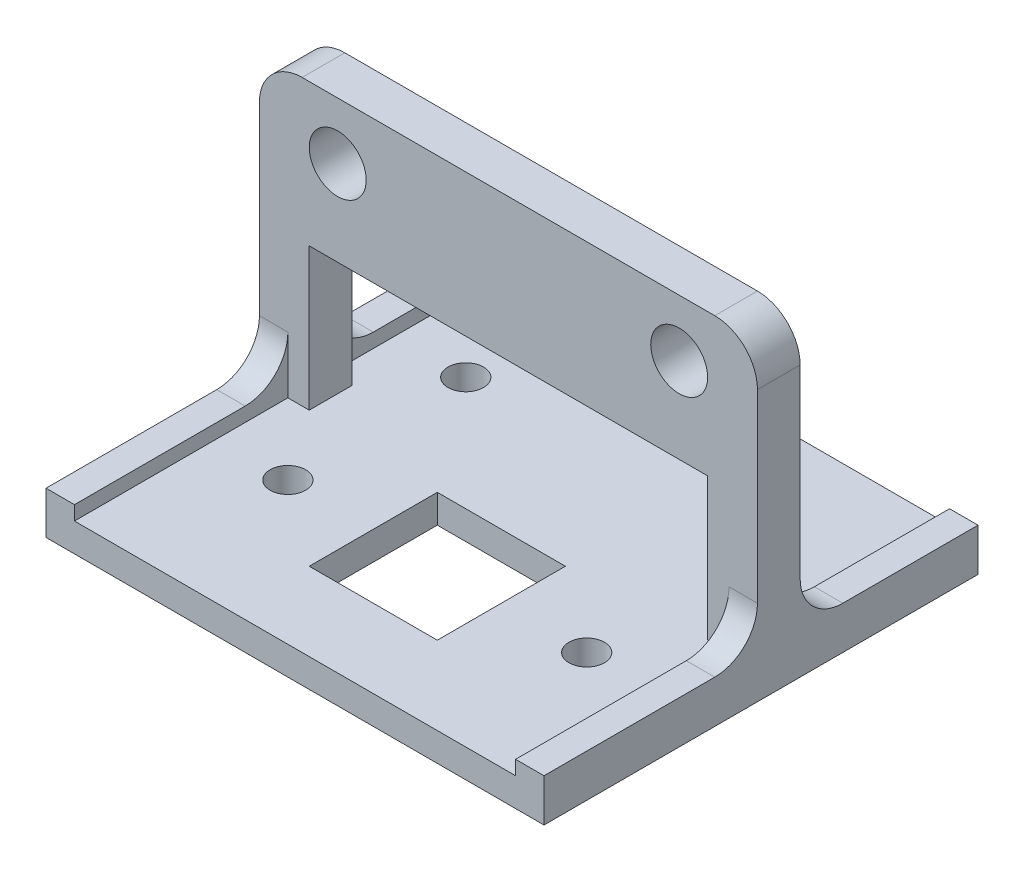
ISO-10303-21;
HEADER;
FILE_DESCRIPTION(('STEP AP214'),'2;1');
FILE_NAME('part.step','',(''),(''),'','','');
FILE_SCHEMA(('AUTOMOTIVE_DESIGN { 1 0 10303 214 1 1 1 1 }'));
ENDSEC;
DATA;
#1=APPLICATION_CONTEXT('core data for automotive mechanical design processes');
#2=APPLICATION_PROTOCOL_DEFINITION('international standard','automotive_design',2000,#1);
#3=PRODUCT_CONTEXT('',#1,'mechanical');
#4=PRODUCT('Part','Part','',(#3));
#5=PRODUCT_RELATED_PRODUCT_CATEGORY('part','',(#4));
#6=PRODUCT_DEFINITION_FORMATION('','',#4);
#7=PRODUCT_DEFINITION_CONTEXT('part definition',#1,'design');
#8=PRODUCT_DEFINITION('design','',#6,#7);
#9=PRODUCT_DEFINITION_SHAPE('','',#8);
#10=(LENGTH_UNIT() NAMED_UNIT(*) SI_UNIT(.MILLI.,.METRE.));
#11=(NAMED_UNIT(*) PLANE_ANGLE_UNIT() SI_UNIT($,.RADIAN.));
#12=(NAMED_UNIT(*) SI_UNIT($,.STERADIAN.) SOLID_ANGLE_UNIT());
#13=UNCERTAINTY_MEASURE_WITH_UNIT(LENGTH_MEASURE(1.E-05),#10,'distance_accuracy_value','');
#14=(GEOMETRIC_REPRESENTATION_CONTEXT(3) GLOBAL_UNCERTAINTY_ASSIGNED_CONTEXT((#13)) GLOBAL_UNIT_ASSIGNED_CONTEXT((#10,
#11,#12)) REPRESENTATION_CONTEXT('',''));
#15=CARTESIAN_POINT('',(0.,0.,0.));
#16=DIRECTION('',(0.,0.,1.));
#17=DIRECTION('',(1.,0.,0.));
#18=AXIS2_PLACEMENT_3D('',#15,#16,#17);
#19=CARTESIAN_POINT('',(0.,3.,0.));
#20=DIRECTION('',(0.,1.,0.));
#21=DIRECTION('',(0.,0.,1.));
#22=AXIS2_PLACEMENT_3D('',#19,#20,#21);
#23=PLANE('',#22);
#24=DIRECTION('',(0.,0.,1.));
#25=VECTOR('',#24,1.);
#26=CARTESIAN_POINT('',(28.,3.,0.499999999999998));
#27=LINE('',#26,#25);
#28=CARTESIAN_POINT('',(28.,3.,-30.));
#29=VERTEX_POINT('',#28);
#30=CARTESIAN_POINT('',(28.,3.,-20.5));
#31=VERTEX_POINT('',#30);
#32=EDGE_CURVE('E368',#29,#31,#27,.T.);
#33=ORIENTED_EDGE('',*,*,#32,.T.);
#34=DIRECTION('',(-1.,0.,0.));
#35=VECTOR('',#34,1.);
#36=CARTESIAN_POINT('',(30.,3.,-20.5));
#37=LINE('',#36,#35);
#38=CARTESIAN_POINT('',(30.,3.,-20.5));
#39=VERTEX_POINT('',#38);
#40=EDGE_CURVE('E479',#31,#39,#37,.F.);
#41=ORIENTED_EDGE('',*,*,#40,.T.);
#42=DIRECTION('',(0.,0.,-1.));
#43=VECTOR('',#42,1.);
#44=CARTESIAN_POINT('',(30.,3.,0.499999999999998));
#45=LINE('',#44,#43);
#46=CARTESIAN_POINT('',(30.,3.,-30.));
#47=VERTEX_POINT('',#46);
#48=EDGE_CURVE('E375',#39,#47,#45,.T.);
#49=ORIENTED_EDGE('',*,*,#48,.T.);
#50=DIRECTION('',(-1.,0.,0.));
#51=VECTOR('',#50,1.);
#52=CARTESIAN_POINT('',(30.,3.,-30.));
#53=LINE('',#52,#51);
#54=EDGE_CURVE('E380',#47,#29,#53,.T.);
#55=ORIENTED_EDGE('',*,*,#54,.T.);
#56=EDGE_LOOP('',(#33,#41,#49,#55));
#57=FACE_BOUND('',#56,.T.);
#58=ADVANCED_FACE('F39',(#57),#23,.T.);
#59=CARTESIAN_POINT('',(0.,2.,0.));
#60=DIRECTION('',(0.,1.,0.));
#61=DIRECTION('',(0.,0.,1.));
#62=AXIS2_PLACEMENT_3D('',#59,#60,#61);
#63=PLANE('',#62);
#64=DIRECTION('',(0.,0.,-1.));
#65=VECTOR('',#64,1.);
#66=CARTESIAN_POINT('',(-1.5,2.,-14.5));
#67=LINE('',#66,#65);
#68=CARTESIAN_POINT('',(-1.5,2.,-14.5));
#69=VERTEX_POINT('',#68);
#70=CARTESIAN_POINT('',(-1.5,2.,-17.5));
#71=VERTEX_POINT('',#70);
#72=EDGE_CURVE('E284',#69,#71,#67,.T.);
#73=ORIENTED_EDGE('',*,*,#72,.F.);
#74=DIRECTION('',(-1.,0.,0.));
#75=VECTOR('',#74,1.);
#76=CARTESIAN_POINT('',(0.,2.,-14.5));
#77=LINE('',#76,#75);
#78=CARTESIAN_POINT('',(-3.,2.,-14.5));
#79=VERTEX_POINT('',#78);
#80=EDGE_CURVE('E329',#69,#79,#77,.T.);
#81=ORIENTED_EDGE('',*,*,#80,.T.);
#82=DIRECTION('',(0.,0.,-1.));
#83=VECTOR('',#82,1.);
#84=CARTESIAN_POINT('',(-3.,2.,0.5));
#85=LINE('',#84,#83);
#86=CARTESIAN_POINT('',(-3.,2.,0.5));
#87=VERTEX_POINT('',#86);
#88=EDGE_CURVE('E244',#87,#79,#85,.T.);
#89=ORIENTED_EDGE('',*,*,#88,.F.);
#90=DIRECTION('',(1.,0.,0.));
#91=VECTOR('',#90,1.);
#92=CARTESIAN_POINT('',(-5.,2.,0.5));
#93=LINE('',#92,#91);
#94=CARTESIAN_POINT('',(28.,2.,0.499999999999998));
#95=VERTEX_POINT('',#94);
#96=EDGE_CURVE('E421',#87,#95,#93,.T.);
#97=ORIENTED_EDGE('',*,*,#96,.T.);
#98=DIRECTION('',(0.,0.,1.));
#99=VECTOR('',#98,1.);
#100=CARTESIAN_POINT('',(28.,2.,0.499999999999998));
#101=LINE('',#100,#99);
#102=CARTESIAN_POINT('',(28.,2.,-14.5));
#103=VERTEX_POINT('',#102);
#104=EDGE_CURVE('E385',#103,#95,#101,.T.);
#105=ORIENTED_EDGE('',*,*,#104,.F.);
#106=CARTESIAN_POINT('',(26.5,2.,-14.5));
#107=VERTEX_POINT('',#106);
#108=EDGE_CURVE('E331',#103,#107,#77,.T.);
#109=ORIENTED_EDGE('',*,*,#108,.T.);
#110=DIRECTION('',(0.,0.,-1.));
#111=VECTOR('',#110,1.);
#112=CARTESIAN_POINT('',(26.5,2.,-14.5));
#113=LINE('',#112,#111);
#114=CARTESIAN_POINT('',(26.5,2.,-17.5));
#115=VERTEX_POINT('',#114);
#116=EDGE_CURVE('E272',#107,#115,#113,.T.);
#117=ORIENTED_EDGE('',*,*,#116,.T.);
#118=DIRECTION('',(-1.,0.,0.));
#119=VECTOR('',#118,1.);
#120=CARTESIAN_POINT('',(0.,2.,-17.5));
#121=LINE('',#120,#119);
#122=CARTESIAN_POINT('',(28.,2.,-17.5));
#123=VERTEX_POINT('',#122);
#124=EDGE_CURVE('E323',#123,#115,#121,.T.);
#125=ORIENTED_EDGE('',*,*,#124,.F.);
#126=CARTESIAN_POINT('',(28.,2.,-30.));
#127=VERTEX_POINT('',#126);
#128=EDGE_CURVE('E253',#127,#123,#101,.T.);
#129=ORIENTED_EDGE('',*,*,#128,.F.);
#130=DIRECTION('',(1.,0.,0.));
#131=VECTOR('',#130,1.);
#132=CARTESIAN_POINT('',(-3.,2.,-30.));
#133=LINE('',#132,#131);
#134=CARTESIAN_POINT('',(-3.,2.,-30.));
#135=VERTEX_POINT('',#134);
#136=EDGE_CURVE('E246',#135,#127,#133,.T.);
#137=ORIENTED_EDGE('',*,*,#136,.F.);
#138=CARTESIAN_POINT('',(-3.,2.,-17.5));
#139=VERTEX_POINT('',#138);
#140=EDGE_CURVE('E233',#139,#135,#85,.T.);
#141=ORIENTED_EDGE('',*,*,#140,.F.);
#142=EDGE_CURVE('E324',#71,#139,#121,.T.);
#143=ORIENTED_EDGE('',*,*,#142,.F.);
#144=EDGE_LOOP('',(#73,#81,#89,#97,#105,#109,#117,#125,#129,#137,#141,#143));
#145=FACE_BOUND('',#144,.T.);
#146=CARTESIAN_POINT('',(23.,2.,-22.));
#147=DIRECTION('',(0.,1.,0.));
#148=DIRECTION('',(0.,0.,1.));
#149=AXIS2_PLACEMENT_3D('',#146,#147,#148);
#150=CIRCLE('',#149,1.25);
#151=CARTESIAN_POINT('',(23.,2.,-20.75));
#152=VERTEX_POINT('',#151);
#153=EDGE_CURVE('E346',#152,#152,#150,.T.);
#154=ORIENTED_EDGE('',*,*,#153,.F.);
#155=EDGE_LOOP('',(#154));
#156=FACE_BOUND('',#155,.T.);
#157=CARTESIAN_POINT('',(2.,2.,-22.));
#158=DIRECTION('',(0.,1.,0.));
#159=DIRECTION('',(0.,0.,1.));
#160=AXIS2_PLACEMENT_3D('',#157,#158,#159);
#161=CIRCLE('',#160,1.25);
#162=CARTESIAN_POINT('',(2.,2.,-20.75));
#163=VERTEX_POINT('',#162);
#164=EDGE_CURVE('E345',#163,#163,#161,.T.);
#165=ORIENTED_EDGE('',*,*,#164,.F.);
#166=EDGE_LOOP('',(#165));
#167=FACE_BOUND('',#166,.T.);
#168=DIRECTION('',(0.,0.,1.));
#169=VECTOR('',#168,1.);
#170=CARTESIAN_POINT('',(8.,2.,-14.));
#171=LINE('',#170,#169);
#172=CARTESIAN_POINT('',(8.,2.,-14.));
#173=VERTEX_POINT('',#172);
#174=CARTESIAN_POINT('',(8.,2.,-5.));
#175=VERTEX_POINT('',#174);
#176=EDGE_CURVE('E395',#173,#175,#171,.T.);
#177=ORIENTED_EDGE('',*,*,#176,.F.);
#178=DIRECTION('',(-1.,0.,0.));
#179=VECTOR('',#178,1.);
#180=CARTESIAN_POINT('',(8.,2.,-14.));
#181=LINE('',#180,#179);
#182=CARTESIAN_POINT('',(17.,2.,-14.));
#183=VERTEX_POINT('',#182);
#184=EDGE_CURVE('E388',#183,#173,#181,.T.);
#185=ORIENTED_EDGE('',*,*,#184,.F.);
#186=DIRECTION('',(0.,0.,-1.));
#187=VECTOR('',#186,1.);
#188=CARTESIAN_POINT('',(17.,2.,-14.));
#189=LINE('',#188,#187);
#190=CARTESIAN_POINT('',(17.,2.,-5.));
#191=VERTEX_POINT('',#190);
#192=EDGE_CURVE('E400',#191,#183,#189,.T.);
#193=ORIENTED_EDGE('',*,*,#192,.F.);
#194=DIRECTION('',(1.,0.,0.));
#195=VECTOR('',#194,1.);
#196=CARTESIAN_POINT('',(8.,2.,-5.));
#197=LINE('',#196,#195);
#198=EDGE_CURVE('E394',#175,#191,#197,.T.);
#199=ORIENTED_EDGE('',*,*,#198,.F.);
#200=EDGE_LOOP('',(#177,#185,#193,#199));
#201=FACE_BOUND('',#200,.T.);
#202=CARTESIAN_POINT('',(2.,2.,-9.5));
#203=DIRECTION('',(0.,1.,0.));
#204=DIRECTION('',(0.,0.,1.));
#205=AXIS2_PLACEMENT_3D('',#202,#203,#204);
#206=CIRCLE('',#205,1.25);
#207=CARTESIAN_POINT('',(2.,2.,-8.25));
#208=VERTEX_POINT('',#207);
#209=EDGE_CURVE('E336',#208,#208,#206,.T.);
#210=ORIENTED_EDGE('',*,*,#209,.F.);
#211=EDGE_LOOP('',(#210));
#212=FACE_BOUND('',#211,.T.);
#213=CARTESIAN_POINT('',(23.,2.,-9.5));
#214=DIRECTION('',(0.,1.,0.));
#215=DIRECTION('',(0.,0.,1.));
#216=AXIS2_PLACEMENT_3D('',#213,#214,#215);
#217=CIRCLE('',#216,1.25);
#218=CARTESIAN_POINT('',(23.,2.,-8.25));
#219=VERTEX_POINT('',#218);
#220=EDGE_CURVE('E339',#219,#219,#217,.T.);
#221=ORIENTED_EDGE('',*,*,#220,.F.);
#222=EDGE_LOOP('',(#221));
#223=FACE_BOUND('',#222,.T.);
#224=ADVANCED_FACE('F248',(#145,#156,#167,#201,#212,#223),#63,.T.);
#225=CARTESIAN_POINT('',(-3.,3.,0.5));
#226=DIRECTION('',(-1.,0.,0.));
#227=DIRECTION('',(0.,0.,1.));
#228=AXIS2_PLACEMENT_3D('',#225,#226,#227);
#229=PLANE('',#228);
#230=DIRECTION('',(0.,-1.,0.));
#231=VECTOR('',#230,1.);
#232=CARTESIAN_POINT('',(-3.,3.,-14.5));
#233=LINE('',#232,#231);
#234=CARTESIAN_POINT('',(-3.,6.,-14.5));
#235=VERTEX_POINT('',#234);
#236=EDGE_CURVE('E330',#235,#79,#233,.T.);
#237=ORIENTED_EDGE('',*,*,#236,.F.);
#238=CARTESIAN_POINT('',(-3.,6.,-11.5));
#239=DIRECTION('',(-1.,0.,0.));
#240=DIRECTION('',(0.,0.,1.));
#241=AXIS2_PLACEMENT_3D('',#238,#239,#240);
#242=CIRCLE('',#241,3.);
#243=CARTESIAN_POINT('',(-3.,3.,-11.5));
#244=VERTEX_POINT('',#243);
#245=EDGE_CURVE('E489',#235,#244,#242,.T.);
#246=ORIENTED_EDGE('',*,*,#245,.T.);
#247=DIRECTION('',(0.,0.,-1.));
#248=VECTOR('',#247,1.);
#249=CARTESIAN_POINT('',(-3.,3.,0.5));
#250=LINE('',#249,#248);
#251=CARTESIAN_POINT('',(-3.,3.,0.5));
#252=VERTEX_POINT('',#251);
#253=EDGE_CURVE('E361',#252,#244,#250,.T.);
#254=ORIENTED_EDGE('',*,*,#253,.F.);
#255=DIRECTION('',(0.,-1.,0.));
#256=VECTOR('',#255,1.);
#257=CARTESIAN_POINT('',(-3.,3.,0.5));
#258=LINE('',#257,#256);
#259=EDGE_CURVE('E387',#252,#87,#258,.T.);
#260=ORIENTED_EDGE('',*,*,#259,.T.);
#261=ORIENTED_EDGE('',*,*,#88,.T.);
#262=EDGE_LOOP('',(#237,#246,#254,#260,#261));
#263=FACE_BOUND('',#262,.T.);
#264=ADVANCED_FACE('F559',(#263),#229,.F.);
#265=CARTESIAN_POINT('',(28.,3.,0.499999999999998));
#266=DIRECTION('',(1.,0.,0.));
#267=DIRECTION('',(0.,0.,-1.));
#268=AXIS2_PLACEMENT_3D('',#265,#266,#267);
#269=PLANE('',#268);
#270=DIRECTION('',(0.,1.,0.));
#271=VECTOR('',#270,1.);
#272=CARTESIAN_POINT('',(28.,3.,-14.5));
#273=LINE('',#272,#271);
#274=CARTESIAN_POINT('',(28.,6.,-14.5));
#275=VERTEX_POINT('',#274);
#276=EDGE_CURVE('E332',#103,#275,#273,.T.);
#277=ORIENTED_EDGE('',*,*,#276,.F.);
#278=ORIENTED_EDGE('',*,*,#104,.T.);
#279=DIRECTION('',(0.,-1.,0.));
#280=VECTOR('',#279,1.);
#281=CARTESIAN_POINT('',(28.,3.,0.499999999999998));
#282=LINE('',#281,#280);
#283=CARTESIAN_POINT('',(28.,3.,0.499999999999998));
#284=VERTEX_POINT('',#283);
#285=EDGE_CURVE('E377',#284,#95,#282,.T.);
#286=ORIENTED_EDGE('',*,*,#285,.F.);
#287=CARTESIAN_POINT('',(28.,3.,-11.5));
#288=VERTEX_POINT('',#287);
#289=EDGE_CURVE('E370',#288,#284,#27,.T.);
#290=ORIENTED_EDGE('',*,*,#289,.F.);
#291=CARTESIAN_POINT('',(28.,6.,-11.5));
#292=DIRECTION('',(1.,0.,0.));
#293=DIRECTION('',(0.,0.,-1.));
#294=AXIS2_PLACEMENT_3D('',#291,#292,#293);
#295=CIRCLE('',#294,3.);
#296=EDGE_CURVE('E482',#288,#275,#295,.T.);
#297=ORIENTED_EDGE('',*,*,#296,.T.);
#298=EDGE_LOOP('',(#277,#278,#286,#290,#297));
#299=FACE_BOUND('',#298,.T.);
#300=ADVANCED_FACE('F578',(#299),#269,.F.);
#301=CARTESIAN_POINT('',(30.,3.,0.499999999999998));
#302=VERTEX_POINT('',#301);
#303=CARTESIAN_POINT('',(30.,3.,-11.5));
#304=VERTEX_POINT('',#303);
#305=EDGE_CURVE('E371',#302,#304,#45,.T.);
#306=ORIENTED_EDGE('',*,*,#305,.T.);
#307=DIRECTION('',(-1.,0.,0.));
#308=VECTOR('',#307,1.);
#309=CARTESIAN_POINT('',(0.,3.,-11.5));
#310=LINE('',#309,#308);
#311=EDGE_CURVE('E475',#304,#288,#310,.T.);
#312=ORIENTED_EDGE('',*,*,#311,.T.);
#313=ORIENTED_EDGE('',*,*,#289,.T.);
#314=DIRECTION('',(1.,0.,0.));
#315=VECTOR('',#314,1.);
#316=CARTESIAN_POINT('',(28.,3.,0.499999999999998));
#317=LINE('',#316,#315);
#318=EDGE_CURVE('E369',#284,#302,#317,.T.);
#319=ORIENTED_EDGE('',*,*,#318,.T.);
#320=EDGE_LOOP('',(#306,#312,#313,#319));
#321=FACE_BOUND('',#320,.T.);
#322=ADVANCED_FACE('F586',(#321),#23,.T.);
#323=ORIENTED_EDGE('',*,*,#253,.T.);
#324=DIRECTION('',(-1.,0.,0.));
#325=VECTOR('',#324,1.);
#326=CARTESIAN_POINT('',(0.,3.,-11.5));
#327=LINE('',#326,#325);
#328=CARTESIAN_POINT('',(-5.,3.,-11.5));
#329=VERTEX_POINT('',#328);
#330=EDGE_CURVE('E476',#244,#329,#327,.T.);
#331=ORIENTED_EDGE('',*,*,#330,.T.);
#332=DIRECTION('',(0.,0.,1.));
#333=VECTOR('',#332,1.);
#334=CARTESIAN_POINT('',(-5.,3.,-30.));
#335=LINE('',#334,#333);
#336=CARTESIAN_POINT('',(-5.,3.,0.5));
#337=VERTEX_POINT('',#336);
#338=EDGE_CURVE('E362',#329,#337,#335,.T.);
#339=ORIENTED_EDGE('',*,*,#338,.T.);
#340=DIRECTION('',(1.,0.,0.));
#341=VECTOR('',#340,1.);
#342=CARTESIAN_POINT('',(-5.,3.,0.5));
#343=LINE('',#342,#341);
#344=EDGE_CURVE('E358',#337,#252,#343,.T.);
#345=ORIENTED_EDGE('',*,*,#344,.T.);
#346=EDGE_LOOP('',(#323,#331,#339,#345));
#347=FACE_BOUND('',#346,.T.);
#348=ADVANCED_FACE('F548',(#347),#23,.T.);
#349=CARTESIAN_POINT('',(0.,0.,0.));
#350=DIRECTION('',(0.,1.,0.));
#351=DIRECTION('',(0.,0.,1.));
#352=AXIS2_PLACEMENT_3D('',#349,#350,#351);
#353=PLANE('',#352);
#354=CARTESIAN_POINT('',(23.,0.,-9.5));
#355=DIRECTION('',(0.,1.,0.));
#356=DIRECTION('',(0.,0.,1.));
#357=AXIS2_PLACEMENT_3D('',#354,#355,#356);
#358=CIRCLE('',#357,1.25);
#359=CARTESIAN_POINT('',(23.,0.,-8.25));
#360=VERTEX_POINT('',#359);
#361=EDGE_CURVE('E343',#360,#360,#358,.F.);
#362=ORIENTED_EDGE('',*,*,#361,.F.);
#363=EDGE_LOOP('',(#362));
#364=FACE_BOUND('',#363,.T.);
#365=CARTESIAN_POINT('',(2.,0.,-9.5));
#366=DIRECTION('',(0.,1.,0.));
#367=DIRECTION('',(0.,0.,1.));
#368=AXIS2_PLACEMENT_3D('',#365,#366,#367);
#369=CIRCLE('',#368,1.25);
#370=CARTESIAN_POINT('',(2.,0.,-8.25));
#371=VERTEX_POINT('',#370);
#372=EDGE_CURVE('E334',#371,#371,#369,.F.);
#373=ORIENTED_EDGE('',*,*,#372,.F.);
#374=EDGE_LOOP('',(#373));
#375=FACE_BOUND('',#374,.T.);
#376=DIRECTION('',(1.,0.,0.));
#377=VECTOR('',#376,1.);
#378=CARTESIAN_POINT('',(-5.,0.,0.5));
#379=LINE('',#378,#377);
#380=CARTESIAN_POINT('',(-5.,0.,0.5));
#381=VERTEX_POINT('',#380);
#382=CARTESIAN_POINT('',(30.,0.,0.499999999999998));
#383=VERTEX_POINT('',#382);
#384=EDGE_CURVE('E419',#381,#383,#379,.T.);
#385=ORIENTED_EDGE('',*,*,#384,.F.);
#386=DIRECTION('',(0.,0.,1.));
#387=VECTOR('',#386,1.);
#388=CARTESIAN_POINT('',(-5.,0.,0.5));
#389=LINE('',#388,#387);
#390=CARTESIAN_POINT('',(-5.,0.,-30.));
#391=VERTEX_POINT('',#390);
#392=EDGE_CURVE('E424',#391,#381,#389,.T.);
#393=ORIENTED_EDGE('',*,*,#392,.F.);
#394=DIRECTION('',(-1.,0.,0.));
#395=VECTOR('',#394,1.);
#396=CARTESIAN_POINT('',(-5.,0.,-30.));
#397=LINE('',#396,#395);
#398=CARTESIAN_POINT('',(30.,0.,-30.));
#399=VERTEX_POINT('',#398);
#400=EDGE_CURVE('E429',#399,#391,#397,.T.);
#401=ORIENTED_EDGE('',*,*,#400,.F.);
#402=DIRECTION('',(0.,0.,-1.));
#403=VECTOR('',#402,1.);
#404=CARTESIAN_POINT('',(30.,0.,0.499999999999998));
#405=LINE('',#404,#403);
#406=EDGE_CURVE('E427',#383,#399,#405,.T.);
#407=ORIENTED_EDGE('',*,*,#406,.F.);
#408=EDGE_LOOP('',(#385,#393,#401,#407));
#409=FACE_BOUND('',#408,.T.);
#410=DIRECTION('',(-1.,0.,0.));
#411=VECTOR('',#410,1.);
#412=CARTESIAN_POINT('',(8.,0.,-14.));
#413=LINE('',#412,#411);
#414=CARTESIAN_POINT('',(17.,0.,-14.));
#415=VERTEX_POINT('',#414);
#416=CARTESIAN_POINT('',(8.,0.,-14.));
#417=VERTEX_POINT('',#416);
#418=EDGE_CURVE('E386',#415,#417,#413,.T.);
#419=ORIENTED_EDGE('',*,*,#418,.T.);
#420=DIRECTION('',(0.,0.,1.));
#421=VECTOR('',#420,1.);
#422=CARTESIAN_POINT('',(8.,0.,-14.));
#423=LINE('',#422,#421);
#424=CARTESIAN_POINT('',(8.,0.,-5.));
#425=VERTEX_POINT('',#424);
#426=EDGE_CURVE('E403',#417,#425,#423,.T.);
#427=ORIENTED_EDGE('',*,*,#426,.T.);
#428=DIRECTION('',(1.,0.,0.));
#429=VECTOR('',#428,1.);
#430=CARTESIAN_POINT('',(8.,0.,-5.));
#431=LINE('',#430,#429);
#432=CARTESIAN_POINT('',(17.,0.,-5.));
#433=VERTEX_POINT('',#432);
#434=EDGE_CURVE('E408',#425,#433,#431,.T.);
#435=ORIENTED_EDGE('',*,*,#434,.T.);
#436=DIRECTION('',(0.,0.,-1.));
#437=VECTOR('',#436,1.);
#438=CARTESIAN_POINT('',(17.,0.,-14.));
#439=LINE('',#438,#437);
#440=EDGE_CURVE('E393',#433,#415,#439,.T.);
#441=ORIENTED_EDGE('',*,*,#440,.T.);
#442=EDGE_LOOP('',(#419,#427,#435,#441));
#443=FACE_BOUND('',#442,.T.);
#444=CARTESIAN_POINT('',(23.,0.,-22.));
#445=DIRECTION('',(0.,1.,0.));
#446=DIRECTION('',(0.,0.,1.));
#447=AXIS2_PLACEMENT_3D('',#444,#445,#446);
#448=CIRCLE('',#447,1.25);
#449=CARTESIAN_POINT('',(23.,0.,-20.75));
#450=VERTEX_POINT('',#449);
#451=EDGE_CURVE('E347',#450,#450,#448,.F.);
#452=ORIENTED_EDGE('',*,*,#451,.F.);
#453=EDGE_LOOP('',(#452));
#454=FACE_BOUND('',#453,.T.);
#455=CARTESIAN_POINT('',(2.,0.,-22.));
#456=DIRECTION('',(0.,1.,0.));
#457=DIRECTION('',(0.,0.,1.));
#458=AXIS2_PLACEMENT_3D('',#455,#456,#457);
#459=CIRCLE('',#458,1.25);
#460=CARTESIAN_POINT('',(2.,0.,-20.75));
#461=VERTEX_POINT('',#460);
#462=EDGE_CURVE('E247',#461,#461,#459,.F.);
#463=ORIENTED_EDGE('',*,*,#462,.F.);
#464=EDGE_LOOP('',(#463));
#465=FACE_BOUND('',#464,.T.);
#466=ADVANCED_FACE('F536',(#364,#375,#409,#443,#454,#465),#353,.F.);
#467=CARTESIAN_POINT('',(-5.,2.,0.5));
#468=DIRECTION('',(0.,0.,-1.));
#469=DIRECTION('',(-1.,0.,0.));
#470=AXIS2_PLACEMENT_3D('',#467,#468,#469);
#471=PLANE('',#470);
#472=ORIENTED_EDGE('',*,*,#384,.T.);
#473=DIRECTION('',(0.,-1.,0.));
#474=VECTOR('',#473,1.);
#475=CARTESIAN_POINT('',(30.,2.,0.499999999999998));
#476=LINE('',#475,#474);
#477=EDGE_CURVE('E441',#302,#383,#476,.T.);
#478=ORIENTED_EDGE('',*,*,#477,.F.);
#479=ORIENTED_EDGE('',*,*,#318,.F.);
#480=ORIENTED_EDGE('',*,*,#285,.T.);
#481=ORIENTED_EDGE('',*,*,#96,.F.);
#482=ORIENTED_EDGE('',*,*,#259,.F.);
#483=ORIENTED_EDGE('',*,*,#344,.F.);
#484=DIRECTION('',(0.,-1.,0.));
#485=VECTOR('',#484,1.);
#486=CARTESIAN_POINT('',(-5.,2.,0.5));
#487=LINE('',#486,#485);
#488=EDGE_CURVE('E422',#337,#381,#487,.T.);
#489=ORIENTED_EDGE('',*,*,#488,.T.);
#490=EDGE_LOOP('',(#472,#478,#479,#480,#481,#482,#483,#489));
#491=FACE_BOUND('',#490,.T.);
#492=ADVANCED_FACE('F544',(#491),#471,.F.);
#493=CARTESIAN_POINT('',(30.,2.,0.499999999999998));
#494=DIRECTION('',(-1.,0.,0.));
#495=DIRECTION('',(0.,0.,1.));
#496=AXIS2_PLACEMENT_3D('',#493,#494,#495);
#497=PLANE('',#496);
#498=DIRECTION('',(0.,1.,0.));
#499=VECTOR('',#498,1.);
#500=CARTESIAN_POINT('',(30.,0.,-17.5));
#501=LINE('',#500,#499);
#502=CARTESIAN_POINT('',(30.,6.,-17.5));
#503=VERTEX_POINT('',#502);
#504=CARTESIAN_POINT('',(30.,19.,-17.5));
#505=VERTEX_POINT('',#504);
#506=EDGE_CURVE('E316',#503,#505,#501,.T.);
#507=ORIENTED_EDGE('',*,*,#506,.T.);
#508=DIRECTION('',(0.,0.,-1.));
#509=VECTOR('',#508,1.);
#510=CARTESIAN_POINT('',(30.,19.,0.499999999999998));
#511=LINE('',#510,#509);
#512=CARTESIAN_POINT('',(30.,19.,-14.5));
#513=VERTEX_POINT('',#512);
#514=EDGE_CURVE('E459',#505,#513,#511,.F.);
#515=ORIENTED_EDGE('',*,*,#514,.T.);
#516=DIRECTION('',(0.,1.,0.));
#517=VECTOR('',#516,1.);
#518=CARTESIAN_POINT('',(30.,0.,-14.5));
#519=LINE('',#518,#517);
#520=CARTESIAN_POINT('',(30.,6.,-14.5));
#521=VERTEX_POINT('',#520);
#522=EDGE_CURVE('E310',#521,#513,#519,.T.);
#523=ORIENTED_EDGE('',*,*,#522,.F.);
#524=CARTESIAN_POINT('',(30.,6.,-11.5));
#525=DIRECTION('',(-1.,0.,0.));
#526=DIRECTION('',(0.,0.,1.));
#527=AXIS2_PLACEMENT_3D('',#524,#525,#526);
#528=CIRCLE('',#527,3.);
#529=EDGE_CURVE('E484',#521,#304,#528,.T.);
#530=ORIENTED_EDGE('',*,*,#529,.T.);
#531=ORIENTED_EDGE('',*,*,#305,.F.);
#532=ORIENTED_EDGE('',*,*,#477,.T.);
#533=ORIENTED_EDGE('',*,*,#406,.T.);
#534=DIRECTION('',(0.,-1.,0.));
#535=VECTOR('',#534,1.);
#536=CARTESIAN_POINT('',(30.,2.,-30.));
#537=LINE('',#536,#535);
#538=EDGE_CURVE('E439',#47,#399,#537,.T.);
#539=ORIENTED_EDGE('',*,*,#538,.F.);
#540=ORIENTED_EDGE('',*,*,#48,.F.);
#541=CARTESIAN_POINT('',(30.,6.,-20.5));
#542=DIRECTION('',(-1.,0.,0.));
#543=DIRECTION('',(0.,0.,1.));
#544=AXIS2_PLACEMENT_3D('',#541,#542,#543);
#545=CIRCLE('',#544,3.);
#546=EDGE_CURVE('E11',#39,#503,#545,.T.);
#547=ORIENTED_EDGE('',*,*,#546,.T.);
#548=EDGE_LOOP('',(#507,#515,#523,#530,#531,#532,#533,#539,#540,#547));
#549=FACE_BOUND('',#548,.T.);
#550=ADVANCED_FACE('F524',(#549),#497,.F.);
#551=CARTESIAN_POINT('',(-5.,2.,-30.));
#552=DIRECTION('',(0.,0.,1.));
#553=DIRECTION('',(1.,0.,0.));
#554=AXIS2_PLACEMENT_3D('',#551,#552,#553);
#555=PLANE('',#554);
#556=CARTESIAN_POINT('',(-3.,3.,-30.));
#557=VERTEX_POINT('',#556);
#558=CARTESIAN_POINT('',(-5.,3.,-30.));
#559=VERTEX_POINT('',#558);
#560=EDGE_CURVE('E263',#557,#559,#53,.T.);
#561=ORIENTED_EDGE('',*,*,#560,.F.);
#562=DIRECTION('',(0.,-1.,0.));
#563=VECTOR('',#562,1.);
#564=CARTESIAN_POINT('',(-3.,3.,-30.));
#565=LINE('',#564,#563);
#566=EDGE_CURVE('E236',#557,#135,#565,.T.);
#567=ORIENTED_EDGE('',*,*,#566,.T.);
#568=ORIENTED_EDGE('',*,*,#136,.T.);
#569=DIRECTION('',(0.,1.,0.));
#570=VECTOR('',#569,1.);
#571=CARTESIAN_POINT('',(28.,2.,-30.));
#572=LINE('',#571,#570);
#573=EDGE_CURVE('E257',#127,#29,#572,.T.);
#574=ORIENTED_EDGE('',*,*,#573,.T.);
#575=ORIENTED_EDGE('',*,*,#54,.F.);
#576=ORIENTED_EDGE('',*,*,#538,.T.);
#577=ORIENTED_EDGE('',*,*,#400,.T.);
#578=DIRECTION('',(0.,-1.,0.));
#579=VECTOR('',#578,1.);
#580=CARTESIAN_POINT('',(-5.,2.,-30.));
#581=LINE('',#580,#579);
#582=EDGE_CURVE('E433',#559,#391,#581,.T.);
#583=ORIENTED_EDGE('',*,*,#582,.F.);
#584=EDGE_LOOP('',(#561,#567,#568,#574,#575,#576,#577,#583));
#585=FACE_BOUND('',#584,.T.);
#586=ADVANCED_FACE('F260',(#585),#555,.F.);
#587=CARTESIAN_POINT('',(-5.,2.,0.5));
#588=DIRECTION('',(1.,0.,0.));
#589=DIRECTION('',(0.,0.,-1.));
#590=AXIS2_PLACEMENT_3D('',#587,#588,#589);
#591=PLANE('',#590);
#592=DIRECTION('',(0.,-1.,0.));
#593=VECTOR('',#592,1.);
#594=CARTESIAN_POINT('',(-5.,0.,-14.5));
#595=LINE('',#594,#593);
#596=CARTESIAN_POINT('',(-5.,19.,-14.5));
#597=VERTEX_POINT('',#596);
#598=CARTESIAN_POINT('',(-5.,6.,-14.5));
#599=VERTEX_POINT('',#598);
#600=EDGE_CURVE('E302',#597,#599,#595,.T.);
#601=ORIENTED_EDGE('',*,*,#600,.F.);
#602=DIRECTION('',(0.,0.,-1.));
#603=VECTOR('',#602,1.);
#604=CARTESIAN_POINT('',(-5.,19.,0.5));
#605=LINE('',#604,#603);
#606=CARTESIAN_POINT('',(-5.,19.,-17.5));
#607=VERTEX_POINT('',#606);
#608=EDGE_CURVE('E469',#597,#607,#605,.T.);
#609=ORIENTED_EDGE('',*,*,#608,.T.);
#610=DIRECTION('',(0.,-1.,0.));
#611=VECTOR('',#610,1.);
#612=CARTESIAN_POINT('',(-5.,0.,-17.5));
#613=LINE('',#612,#611);
#614=CARTESIAN_POINT('',(-5.,6.,-17.5));
#615=VERTEX_POINT('',#614);
#616=EDGE_CURVE('E301',#607,#615,#613,.T.);
#617=ORIENTED_EDGE('',*,*,#616,.T.);
#618=CARTESIAN_POINT('',(-5.,6.,-20.5));
#619=DIRECTION('',(1.,0.,0.));
#620=DIRECTION('',(0.,0.,-1.));
#621=AXIS2_PLACEMENT_3D('',#618,#619,#620);
#622=CIRCLE('',#621,3.);
#623=CARTESIAN_POINT('',(-5.,3.,-20.5));
#624=VERTEX_POINT('',#623);
#625=EDGE_CURVE('E491',#615,#624,#622,.T.);
#626=ORIENTED_EDGE('',*,*,#625,.T.);
#627=EDGE_CURVE('E359',#559,#624,#335,.T.);
#628=ORIENTED_EDGE('',*,*,#627,.F.);
#629=ORIENTED_EDGE('',*,*,#582,.T.);
#630=ORIENTED_EDGE('',*,*,#392,.T.);
#631=ORIENTED_EDGE('',*,*,#488,.F.);
#632=ORIENTED_EDGE('',*,*,#338,.F.);
#633=CARTESIAN_POINT('',(-5.,6.,-11.5));
#634=DIRECTION('',(1.,0.,0.));
#635=DIRECTION('',(0.,0.,-1.));
#636=AXIS2_PLACEMENT_3D('',#633,#634,#635);
#637=CIRCLE('',#636,3.);
#638=EDGE_CURVE('E490',#329,#599,#637,.T.);
#639=ORIENTED_EDGE('',*,*,#638,.T.);
#640=EDGE_LOOP('',(#601,#609,#617,#626,#628,#629,#630,#631,#632,#639));
#641=FACE_BOUND('',#640,.T.);
#642=ADVANCED_FACE('F503',(#641),#591,.F.);
#643=CARTESIAN_POINT('',(8.,2.,-14.));
#644=DIRECTION('',(0.,0.,1.));
#645=DIRECTION('',(1.,0.,0.));
#646=AXIS2_PLACEMENT_3D('',#643,#644,#645);
#647=PLANE('',#646);
#648=ORIENTED_EDGE('',*,*,#418,.F.);
#649=DIRECTION('',(0.,-1.,0.));
#650=VECTOR('',#649,1.);
#651=CARTESIAN_POINT('',(17.,2.,-14.));
#652=LINE('',#651,#650);
#653=EDGE_CURVE('E398',#183,#415,#652,.T.);
#654=ORIENTED_EDGE('',*,*,#653,.F.);
#655=ORIENTED_EDGE('',*,*,#184,.T.);
#656=DIRECTION('',(0.,-1.,0.));
#657=VECTOR('',#656,1.);
#658=CARTESIAN_POINT('',(8.,2.,-14.));
#659=LINE('',#658,#657);
#660=EDGE_CURVE('E420',#173,#417,#659,.T.);
#661=ORIENTED_EDGE('',*,*,#660,.T.);
#662=EDGE_LOOP('',(#648,#654,#655,#661));
#663=FACE_BOUND('',#662,.T.);
#664=ADVANCED_FACE('F633',(#663),#647,.T.);
#665=CARTESIAN_POINT('',(8.,2.,-14.));
#666=DIRECTION('',(1.,0.,0.));
#667=DIRECTION('',(0.,0.,-1.));
#668=AXIS2_PLACEMENT_3D('',#665,#666,#667);
#669=PLANE('',#668);
#670=ORIENTED_EDGE('',*,*,#426,.F.);
#671=ORIENTED_EDGE('',*,*,#660,.F.);
#672=ORIENTED_EDGE('',*,*,#176,.T.);
#673=DIRECTION('',(0.,-1.,0.));
#674=VECTOR('',#673,1.);
#675=CARTESIAN_POINT('',(8.,2.,-5.));
#676=LINE('',#675,#674);
#677=EDGE_CURVE('E412',#175,#425,#676,.T.);
#678=ORIENTED_EDGE('',*,*,#677,.T.);
#679=EDGE_LOOP('',(#670,#671,#672,#678));
#680=FACE_BOUND('',#679,.T.);
#681=ADVANCED_FACE('F630',(#680),#669,.T.);
#682=CARTESIAN_POINT('',(8.,2.,-5.));
#683=DIRECTION('',(0.,0.,-1.));
#684=DIRECTION('',(-1.,0.,0.));
#685=AXIS2_PLACEMENT_3D('',#682,#683,#684);
#686=PLANE('',#685);
#687=ORIENTED_EDGE('',*,*,#434,.F.);
#688=ORIENTED_EDGE('',*,*,#677,.F.);
#689=ORIENTED_EDGE('',*,*,#198,.T.);
#690=DIRECTION('',(0.,-1.,0.));
#691=VECTOR('',#690,1.);
#692=CARTESIAN_POINT('',(17.,2.,-5.));
#693=LINE('',#692,#691);
#694=EDGE_CURVE('E411',#191,#433,#693,.T.);
#695=ORIENTED_EDGE('',*,*,#694,.T.);
#696=EDGE_LOOP('',(#687,#688,#689,#695));
#697=FACE_BOUND('',#696,.T.);
#698=ADVANCED_FACE('F625',(#697),#686,.T.);
#699=CARTESIAN_POINT('',(17.,2.,-14.));
#700=DIRECTION('',(-1.,0.,0.));
#701=DIRECTION('',(0.,0.,1.));
#702=AXIS2_PLACEMENT_3D('',#699,#700,#701);
#703=PLANE('',#702);
#704=ORIENTED_EDGE('',*,*,#440,.F.);
#705=ORIENTED_EDGE('',*,*,#694,.F.);
#706=ORIENTED_EDGE('',*,*,#192,.T.);
#707=ORIENTED_EDGE('',*,*,#653,.T.);
#708=EDGE_LOOP('',(#704,#705,#706,#707));
#709=FACE_BOUND('',#708,.T.);
#710=ADVANCED_FACE('F618',(#709),#703,.T.);
#711=CARTESIAN_POINT('',(-3.,3.,-20.5));
#712=VERTEX_POINT('',#711);
#713=EDGE_CURVE('E364',#712,#557,#250,.T.);
#714=ORIENTED_EDGE('',*,*,#713,.F.);
#715=CARTESIAN_POINT('',(-3.,6.,-20.5));
#716=DIRECTION('',(-1.,0.,0.));
#717=DIRECTION('',(0.,0.,1.));
#718=AXIS2_PLACEMENT_3D('',#715,#716,#717);
#719=CIRCLE('',#718,3.);
#720=CARTESIAN_POINT('',(-3.,6.,-17.5));
#721=VERTEX_POINT('',#720);
#722=EDGE_CURVE('E493',#712,#721,#719,.T.);
#723=ORIENTED_EDGE('',*,*,#722,.T.);
#724=DIRECTION('',(0.,-1.,0.));
#725=VECTOR('',#724,1.);
#726=CARTESIAN_POINT('',(-3.,3.,-17.5));
#727=LINE('',#726,#725);
#728=EDGE_CURVE('E245',#721,#139,#727,.T.);
#729=ORIENTED_EDGE('',*,*,#728,.T.);
#730=ORIENTED_EDGE('',*,*,#140,.T.);
#731=ORIENTED_EDGE('',*,*,#566,.F.);
#732=EDGE_LOOP('',(#714,#723,#729,#730,#731));
#733=FACE_BOUND('',#732,.T.);
#734=ADVANCED_FACE('F240',(#733),#229,.F.);
#735=ORIENTED_EDGE('',*,*,#128,.T.);
#736=DIRECTION('',(0.,1.,0.));
#737=VECTOR('',#736,1.);
#738=CARTESIAN_POINT('',(28.,3.,-17.5));
#739=LINE('',#738,#737);
#740=CARTESIAN_POINT('',(28.,6.,-17.5));
#741=VERTEX_POINT('',#740);
#742=EDGE_CURVE('E321',#123,#741,#739,.T.);
#743=ORIENTED_EDGE('',*,*,#742,.T.);
#744=CARTESIAN_POINT('',(28.,6.,-20.5));
#745=DIRECTION('',(1.,0.,0.));
#746=DIRECTION('',(0.,0.,-1.));
#747=AXIS2_PLACEMENT_3D('',#744,#745,#746);
#748=CIRCLE('',#747,3.);
#749=EDGE_CURVE('E50',#741,#31,#748,.T.);
#750=ORIENTED_EDGE('',*,*,#749,.T.);
#751=ORIENTED_EDGE('',*,*,#32,.F.);
#752=ORIENTED_EDGE('',*,*,#573,.F.);
#753=EDGE_LOOP('',(#735,#743,#750,#751,#752));
#754=FACE_BOUND('',#753,.T.);
#755=ADVANCED_FACE('F535',(#754),#269,.F.);
#756=ORIENTED_EDGE('',*,*,#627,.T.);
#757=DIRECTION('',(-1.,0.,0.));
#758=VECTOR('',#757,1.);
#759=CARTESIAN_POINT('',(-3.,3.,-20.5));
#760=LINE('',#759,#758);
#761=EDGE_CURVE('E62',#624,#712,#760,.F.);
#762=ORIENTED_EDGE('',*,*,#761,.T.);
#763=ORIENTED_EDGE('',*,*,#713,.T.);
#764=ORIENTED_EDGE('',*,*,#560,.T.);
#765=EDGE_LOOP('',(#756,#762,#763,#764));
#766=FACE_BOUND('',#765,.T.);
#767=ADVANCED_FACE('F597',(#766),#23,.T.);
#768=CARTESIAN_POINT('',(2.,-0.00100000000000013,-22.));
#769=DIRECTION('',(0.,1.,0.));
#770=DIRECTION('',(0.,0.,1.));
#771=AXIS2_PLACEMENT_3D('',#768,#769,#770);
#772=CYLINDRICAL_SURFACE('',#771,1.25);
#773=ORIENTED_EDGE('',*,*,#164,.T.);
#774=EDGE_LOOP('',(#773));
#775=FACE_BOUND('',#774,.T.);
#776=ORIENTED_EDGE('',*,*,#462,.T.);
#777=EDGE_LOOP('',(#776));
#778=FACE_BOUND('',#777,.T.);
#779=ADVANCED_FACE('F610',(#775,#778),#772,.F.);
#780=CARTESIAN_POINT('',(2.,-0.00100000000000013,-9.5));
#781=DIRECTION('',(0.,1.,0.));
#782=DIRECTION('',(0.,0.,1.));
#783=AXIS2_PLACEMENT_3D('',#780,#781,#782);
#784=CYLINDRICAL_SURFACE('',#783,1.25);
#785=ORIENTED_EDGE('',*,*,#209,.T.);
#786=EDGE_LOOP('',(#785));
#787=FACE_BOUND('',#786,.T.);
#788=ORIENTED_EDGE('',*,*,#372,.T.);
#789=EDGE_LOOP('',(#788));
#790=FACE_BOUND('',#789,.T.);
#791=ADVANCED_FACE('F614',(#787,#790),#784,.F.);
#792=CARTESIAN_POINT('',(23.,-0.00100000000000013,-9.5));
#793=DIRECTION('',(0.,1.,0.));
#794=DIRECTION('',(0.,0.,1.));
#795=AXIS2_PLACEMENT_3D('',#792,#793,#794);
#796=CYLINDRICAL_SURFACE('',#795,1.25);
#797=ORIENTED_EDGE('',*,*,#220,.T.);
#798=EDGE_LOOP('',(#797));
#799=FACE_BOUND('',#798,.T.);
#800=ORIENTED_EDGE('',*,*,#361,.T.);
#801=EDGE_LOOP('',(#800));
#802=FACE_BOUND('',#801,.T.);
#803=ADVANCED_FACE('F843',(#799,#802),#796,.F.);
#804=CARTESIAN_POINT('',(23.,-0.00100000000000013,-22.));
#805=DIRECTION('',(0.,1.,0.));
#806=DIRECTION('',(0.,0.,1.));
#807=AXIS2_PLACEMENT_3D('',#804,#805,#806);
#808=CYLINDRICAL_SURFACE('',#807,1.25);
#809=ORIENTED_EDGE('',*,*,#153,.T.);
#810=EDGE_LOOP('',(#809));
#811=FACE_BOUND('',#810,.T.);
#812=ORIENTED_EDGE('',*,*,#451,.T.);
#813=EDGE_LOOP('',(#812));
#814=FACE_BOUND('',#813,.T.);
#815=ADVANCED_FACE('F786',(#811,#814),#808,.F.);
#816=CARTESIAN_POINT('',(0.,0.,-14.5));
#817=DIRECTION('',(0.,0.,-1.));
#818=DIRECTION('',(-1.,0.,0.));
#819=AXIS2_PLACEMENT_3D('',#816,#817,#818);
#820=PLANE('',#819);
#821=ORIENTED_EDGE('',*,*,#522,.T.);
#822=CARTESIAN_POINT('',(27.,19.,-14.5));
#823=DIRECTION('',(0.,0.,-1.));
#824=DIRECTION('',(-1.,0.,0.));
#825=AXIS2_PLACEMENT_3D('',#822,#823,#824);
#826=CIRCLE('',#825,3.);
#827=CARTESIAN_POINT('',(27.,22.,-14.5));
#828=VERTEX_POINT('',#827);
#829=EDGE_CURVE('E468',#513,#828,#826,.F.);
#830=ORIENTED_EDGE('',*,*,#829,.T.);
#831=DIRECTION('',(-1.,0.,0.));
#832=VECTOR('',#831,1.);
#833=CARTESIAN_POINT('',(-5.,22.,-14.5));
#834=LINE('',#833,#832);
#835=CARTESIAN_POINT('',(-2.,22.,-14.5));
#836=VERTEX_POINT('',#835);
#837=EDGE_CURVE('E312',#828,#836,#834,.T.);
#838=ORIENTED_EDGE('',*,*,#837,.T.);
#839=CARTESIAN_POINT('',(-2.,19.,-14.5));
#840=DIRECTION('',(0.,0.,-1.));
#841=DIRECTION('',(-1.,0.,0.));
#842=AXIS2_PLACEMENT_3D('',#839,#840,#841);
#843=CIRCLE('',#842,3.);
#844=EDGE_CURVE('E466',#836,#597,#843,.F.);
#845=ORIENTED_EDGE('',*,*,#844,.T.);
#846=ORIENTED_EDGE('',*,*,#600,.T.);
#847=DIRECTION('',(-1.,0.,0.));
#848=VECTOR('',#847,1.);
#849=CARTESIAN_POINT('',(0.,6.,-14.5));
#850=LINE('',#849,#848);
#851=EDGE_CURVE('E462',#599,#235,#850,.F.);
#852=ORIENTED_EDGE('',*,*,#851,.T.);
#853=ORIENTED_EDGE('',*,*,#236,.T.);
#854=ORIENTED_EDGE('',*,*,#80,.F.);
#855=DIRECTION('',(0.,-1.,0.));
#856=VECTOR('',#855,1.);
#857=CARTESIAN_POINT('',(-1.5,2.,-14.5));
#858=LINE('',#857,#856);
#859=CARTESIAN_POINT('',(-1.5,12.,-14.5));
#860=VERTEX_POINT('',#859);
#861=EDGE_CURVE('E271',#860,#69,#858,.T.);
#862=ORIENTED_EDGE('',*,*,#861,.F.);
#863=DIRECTION('',(-1.,0.,0.));
#864=VECTOR('',#863,1.);
#865=CARTESIAN_POINT('',(-1.5,12.,-14.5));
#866=LINE('',#865,#864);
#867=CARTESIAN_POINT('',(26.5,12.,-14.5));
#868=VERTEX_POINT('',#867);
#869=EDGE_CURVE('E268',#868,#860,#866,.T.);
#870=ORIENTED_EDGE('',*,*,#869,.F.);
#871=DIRECTION('',(0.,1.,0.));
#872=VECTOR('',#871,1.);
#873=CARTESIAN_POINT('',(26.5,2.,-14.5));
#874=LINE('',#873,#872);
#875=EDGE_CURVE('E266',#107,#868,#874,.T.);
#876=ORIENTED_EDGE('',*,*,#875,.F.);
#877=ORIENTED_EDGE('',*,*,#108,.F.);
#878=ORIENTED_EDGE('',*,*,#276,.T.);
#879=DIRECTION('',(-1.,0.,0.));
#880=VECTOR('',#879,1.);
#881=CARTESIAN_POINT('',(0.,6.,-14.5));
#882=LINE('',#881,#880);
#883=EDGE_CURVE('E461',#275,#521,#882,.F.);
#884=ORIENTED_EDGE('',*,*,#883,.T.);
#885=EDGE_LOOP('',(#821,#830,#838,#845,#846,#852,#853,#854,#862,#870,#876,#877,#878,#884));
#886=FACE_BOUND('',#885,.T.);
#887=CARTESIAN_POINT('',(24.5,18.,-14.5));
#888=DIRECTION('',(0.,0.,1.));
#889=DIRECTION('',(-1.,0.,0.));
#890=AXIS2_PLACEMENT_3D('',#887,#888,#889);
#891=CIRCLE('',#890,2.);
#892=CARTESIAN_POINT('',(22.5,18.,-14.5));
#893=VERTEX_POINT('',#892);
#894=EDGE_CURVE('E295',#893,#893,#891,.T.);
#895=ORIENTED_EDGE('',*,*,#894,.F.);
#896=EDGE_LOOP('',(#895));
#897=FACE_BOUND('',#896,.T.);
#898=CARTESIAN_POINT('',(0.500000000000003,18.,-14.5));
#899=DIRECTION('',(0.,0.,1.));
#900=DIRECTION('',(1.,0.,0.));
#901=AXIS2_PLACEMENT_3D('',#898,#899,#900);
#902=CIRCLE('',#901,2.);
#903=CARTESIAN_POINT('',(2.5,18.,-14.5));
#904=VERTEX_POINT('',#903);
#905=EDGE_CURVE('E300',#904,#904,#902,.T.);
#906=ORIENTED_EDGE('',*,*,#905,.F.);
#907=EDGE_LOOP('',(#906));
#908=FACE_BOUND('',#907,.T.);
#909=ADVANCED_FACE('F554',(#886,#897,#908),#820,.F.);
#910=CARTESIAN_POINT('',(0.,0.,-17.5));
#911=DIRECTION('',(0.,0.,-1.));
#912=DIRECTION('',(-1.,0.,0.));
#913=AXIS2_PLACEMENT_3D('',#910,#911,#912);
#914=PLANE('',#913);
#915=CARTESIAN_POINT('',(0.500000000000003,18.,-17.5));
#916=DIRECTION('',(0.,0.,1.));
#917=DIRECTION('',(1.,0.,0.));
#918=AXIS2_PLACEMENT_3D('',#915,#916,#917);
#919=CIRCLE('',#918,2.);
#920=CARTESIAN_POINT('',(2.5,18.,-17.5));
#921=VERTEX_POINT('',#920);
#922=EDGE_CURVE('E294',#921,#921,#919,.T.);
#923=ORIENTED_EDGE('',*,*,#922,.T.);
#924=EDGE_LOOP('',(#923));
#925=FACE_BOUND('',#924,.T.);
#926=CARTESIAN_POINT('',(24.5,18.,-17.5));
#927=DIRECTION('',(0.,0.,1.));
#928=DIRECTION('',(-1.,0.,0.));
#929=AXIS2_PLACEMENT_3D('',#926,#927,#928);
#930=CIRCLE('',#929,2.);
#931=CARTESIAN_POINT('',(22.5,18.,-17.5));
#932=VERTEX_POINT('',#931);
#933=EDGE_CURVE('E291',#932,#932,#930,.T.);
#934=ORIENTED_EDGE('',*,*,#933,.T.);
#935=EDGE_LOOP('',(#934));
#936=FACE_BOUND('',#935,.T.);
#937=DIRECTION('',(-1.,0.,0.));
#938=VECTOR('',#937,1.);
#939=CARTESIAN_POINT('',(-5.,22.,-17.5));
#940=LINE('',#939,#938);
#941=CARTESIAN_POINT('',(27.,22.,-17.5));
#942=VERTEX_POINT('',#941);
#943=CARTESIAN_POINT('',(-2.,22.,-17.5));
#944=VERTEX_POINT('',#943);
#945=EDGE_CURVE('E306',#942,#944,#940,.T.);
#946=ORIENTED_EDGE('',*,*,#945,.F.);
#947=CARTESIAN_POINT('',(27.,19.,-17.5));
#948=DIRECTION('',(0.,0.,-1.));
#949=DIRECTION('',(-1.,0.,0.));
#950=AXIS2_PLACEMENT_3D('',#947,#948,#949);
#951=CIRCLE('',#950,3.);
#952=EDGE_CURVE('E460',#942,#505,#951,.T.);
#953=ORIENTED_EDGE('',*,*,#952,.T.);
#954=ORIENTED_EDGE('',*,*,#506,.F.);
#955=DIRECTION('',(-1.,0.,0.));
#956=VECTOR('',#955,1.);
#957=CARTESIAN_POINT('',(28.,6.,-17.5));
#958=LINE('',#957,#956);
#959=EDGE_CURVE('E446',#503,#741,#958,.T.);
#960=ORIENTED_EDGE('',*,*,#959,.T.);
#961=ORIENTED_EDGE('',*,*,#742,.F.);
#962=ORIENTED_EDGE('',*,*,#124,.T.);
#963=DIRECTION('',(0.,1.,0.));
#964=VECTOR('',#963,1.);
#965=CARTESIAN_POINT('',(26.5,2.,-17.5));
#966=LINE('',#965,#964);
#967=CARTESIAN_POINT('',(26.5,12.,-17.5));
#968=VERTEX_POINT('',#967);
#969=EDGE_CURVE('E262',#115,#968,#966,.T.);
#970=ORIENTED_EDGE('',*,*,#969,.T.);
#971=DIRECTION('',(-1.,0.,0.));
#972=VECTOR('',#971,1.);
#973=CARTESIAN_POINT('',(-1.5,12.,-17.5));
#974=LINE('',#973,#972);
#975=CARTESIAN_POINT('',(-1.5,12.,-17.5));
#976=VERTEX_POINT('',#975);
#977=EDGE_CURVE('E280',#968,#976,#974,.T.);
#978=ORIENTED_EDGE('',*,*,#977,.T.);
#979=DIRECTION('',(0.,-1.,0.));
#980=VECTOR('',#979,1.);
#981=CARTESIAN_POINT('',(-1.5,2.,-17.5));
#982=LINE('',#981,#980);
#983=EDGE_CURVE('E267',#976,#71,#982,.T.);
#984=ORIENTED_EDGE('',*,*,#983,.T.);
#985=ORIENTED_EDGE('',*,*,#142,.T.);
#986=ORIENTED_EDGE('',*,*,#728,.F.);
#987=DIRECTION('',(-1.,0.,0.));
#988=VECTOR('',#987,1.);
#989=CARTESIAN_POINT('',(-5.,6.,-17.5));
#990=LINE('',#989,#988);
#991=EDGE_CURVE('E455',#721,#615,#990,.T.);
#992=ORIENTED_EDGE('',*,*,#991,.T.);
#993=ORIENTED_EDGE('',*,*,#616,.F.);
#994=CARTESIAN_POINT('',(-2.,19.,-17.5));
#995=DIRECTION('',(0.,0.,-1.));
#996=DIRECTION('',(-1.,0.,0.));
#997=AXIS2_PLACEMENT_3D('',#994,#995,#996);
#998=CIRCLE('',#997,3.);
#999=EDGE_CURVE('E454',#607,#944,#998,.T.);
#1000=ORIENTED_EDGE('',*,*,#999,.T.);
#1001=EDGE_LOOP('',(#946,#953,#954,#960,#961,#962,#970,#978,#984,#985,#986,#992,#993,#1000));
#1002=FACE_BOUND('',#1001,.T.);
#1003=ADVANCED_FACE('F501',(#925,#936,#1002),#914,.T.);
#1004=CARTESIAN_POINT('',(-5.,22.,-14.5));
#1005=DIRECTION('',(0.,-1.,0.));
#1006=DIRECTION('',(1.,0.,0.));
#1007=AXIS2_PLACEMENT_3D('',#1004,#1005,#1006);
#1008=PLANE('',#1007);
#1009=ORIENTED_EDGE('',*,*,#837,.F.);
#1010=DIRECTION('',(0.,0.,-1.));
#1011=VECTOR('',#1010,1.);
#1012=CARTESIAN_POINT('',(27.,22.,-14.5));
#1013=LINE('',#1012,#1011);
#1014=EDGE_CURVE('E447',#828,#942,#1013,.T.);
#1015=ORIENTED_EDGE('',*,*,#1014,.T.);
#1016=ORIENTED_EDGE('',*,*,#945,.T.);
#1017=DIRECTION('',(0.,0.,-1.));
#1018=VECTOR('',#1017,1.);
#1019=CARTESIAN_POINT('',(-2.,22.,-14.5));
#1020=LINE('',#1019,#1018);
#1021=EDGE_CURVE('E442',#944,#836,#1020,.F.);
#1022=ORIENTED_EDGE('',*,*,#1021,.T.);
#1023=EDGE_LOOP('',(#1009,#1015,#1016,#1022));
#1024=FACE_BOUND('',#1023,.T.);
#1025=ADVANCED_FACE('F514',(#1024),#1008,.F.);
#1026=CARTESIAN_POINT('',(0.500000000000003,18.,-14.5));
#1027=DIRECTION('',(0.,0.,-1.));
#1028=DIRECTION('',(-1.,0.,0.));
#1029=AXIS2_PLACEMENT_3D('',#1026,#1027,#1028);
#1030=CYLINDRICAL_SURFACE('',#1029,2.);
#1031=ORIENTED_EDGE('',*,*,#905,.T.);
#1032=EDGE_LOOP('',(#1031));
#1033=FACE_BOUND('',#1032,.T.);
#1034=ORIENTED_EDGE('',*,*,#922,.F.);
#1035=EDGE_LOOP('',(#1034));
#1036=FACE_BOUND('',#1035,.T.);
#1037=ADVANCED_FACE('F754',(#1033,#1036),#1030,.F.);
#1038=CARTESIAN_POINT('',(24.5,18.,-14.5));
#1039=DIRECTION('',(0.,0.,-1.));
#1040=DIRECTION('',(-1.,0.,0.));
#1041=AXIS2_PLACEMENT_3D('',#1038,#1039,#1040);
#1042=CYLINDRICAL_SURFACE('',#1041,2.);
#1043=ORIENTED_EDGE('',*,*,#894,.T.);
#1044=EDGE_LOOP('',(#1043));
#1045=FACE_BOUND('',#1044,.T.);
#1046=ORIENTED_EDGE('',*,*,#933,.F.);
#1047=EDGE_LOOP('',(#1046));
#1048=FACE_BOUND('',#1047,.T.);
#1049=ADVANCED_FACE('F747',(#1045,#1048),#1042,.F.);
#1050=CARTESIAN_POINT('',(26.5,2.,-14.5));
#1051=DIRECTION('',(-1.,0.,0.));
#1052=DIRECTION('',(0.,-1.,0.));
#1053=AXIS2_PLACEMENT_3D('',#1050,#1051,#1052);
#1054=PLANE('',#1053);
#1055=ORIENTED_EDGE('',*,*,#969,.F.);
#1056=ORIENTED_EDGE('',*,*,#116,.F.);
#1057=ORIENTED_EDGE('',*,*,#875,.T.);
#1058=DIRECTION('',(0.,0.,-1.));
#1059=VECTOR('',#1058,1.);
#1060=CARTESIAN_POINT('',(26.5,12.,-14.5));
#1061=LINE('',#1060,#1059);
#1062=EDGE_CURVE('E289',#868,#968,#1061,.T.);
#1063=ORIENTED_EDGE('',*,*,#1062,.T.);
#1064=EDGE_LOOP('',(#1055,#1056,#1057,#1063));
#1065=FACE_BOUND('',#1064,.T.);
#1066=ADVANCED_FACE('F574',(#1065),#1054,.T.);
#1067=CARTESIAN_POINT('',(-1.5,12.,-14.5));
#1068=DIRECTION('',(0.,-1.,0.));
#1069=DIRECTION('',(1.,0.,0.));
#1070=AXIS2_PLACEMENT_3D('',#1067,#1068,#1069);
#1071=PLANE('',#1070);
#1072=ORIENTED_EDGE('',*,*,#977,.F.);
#1073=ORIENTED_EDGE('',*,*,#1062,.F.);
#1074=ORIENTED_EDGE('',*,*,#869,.T.);
#1075=DIRECTION('',(0.,0.,-1.));
#1076=VECTOR('',#1075,1.);
#1077=CARTESIAN_POINT('',(-1.5,12.,-14.5));
#1078=LINE('',#1077,#1076);
#1079=EDGE_CURVE('E287',#860,#976,#1078,.T.);
#1080=ORIENTED_EDGE('',*,*,#1079,.T.);
#1081=EDGE_LOOP('',(#1072,#1073,#1074,#1080));
#1082=FACE_BOUND('',#1081,.T.);
#1083=ADVANCED_FACE('F567',(#1082),#1071,.T.);
#1084=CARTESIAN_POINT('',(-1.5,2.,-14.5));
#1085=DIRECTION('',(1.,0.,0.));
#1086=DIRECTION('',(0.,0.,-1.));
#1087=AXIS2_PLACEMENT_3D('',#1084,#1085,#1086);
#1088=PLANE('',#1087);
#1089=ORIENTED_EDGE('',*,*,#983,.F.);
#1090=ORIENTED_EDGE('',*,*,#1079,.F.);
#1091=ORIENTED_EDGE('',*,*,#861,.T.);
#1092=ORIENTED_EDGE('',*,*,#72,.T.);
#1093=EDGE_LOOP('',(#1089,#1090,#1091,#1092));
#1094=FACE_BOUND('',#1093,.T.);
#1095=ADVANCED_FACE('F570',(#1094),#1088,.T.);
#1096=CARTESIAN_POINT('',(27.,19.,-14.5));
#1097=DIRECTION('',(0.,0.,-1.));
#1098=DIRECTION('',(-1.,0.,0.));
#1099=AXIS2_PLACEMENT_3D('',#1096,#1097,#1098);
#1100=CYLINDRICAL_SURFACE('',#1099,3.);
#1101=ORIENTED_EDGE('',*,*,#829,.F.);
#1102=ORIENTED_EDGE('',*,*,#514,.F.);
#1103=ORIENTED_EDGE('',*,*,#952,.F.);
#1104=ORIENTED_EDGE('',*,*,#1014,.F.);
#1105=EDGE_LOOP('',(#1101,#1102,#1103,#1104));
#1106=FACE_BOUND('',#1105,.T.);
#1107=ADVANCED_FACE('F520',(#1106),#1100,.T.);
#1108=CARTESIAN_POINT('',(-2.,19.,0.5));
#1109=DIRECTION('',(0.,0.,-1.));
#1110=DIRECTION('',(-1.,0.,0.));
#1111=AXIS2_PLACEMENT_3D('',#1108,#1109,#1110);
#1112=CYLINDRICAL_SURFACE('',#1111,3.);
#1113=ORIENTED_EDGE('',*,*,#844,.F.);
#1114=ORIENTED_EDGE('',*,*,#1021,.F.);
#1115=ORIENTED_EDGE('',*,*,#999,.F.);
#1116=ORIENTED_EDGE('',*,*,#608,.F.);
#1117=EDGE_LOOP('',(#1113,#1114,#1115,#1116));
#1118=FACE_BOUND('',#1117,.T.);
#1119=ADVANCED_FACE('F506',(#1118),#1112,.T.);
#1120=CARTESIAN_POINT('',(0.,6.,-11.5));
#1121=DIRECTION('',(-1.,0.,0.));
#1122=DIRECTION('',(0.,0.,1.));
#1123=AXIS2_PLACEMENT_3D('',#1120,#1121,#1122);
#1124=CYLINDRICAL_SURFACE('',#1123,3.);
#1125=ORIENTED_EDGE('',*,*,#529,.F.);
#1126=ORIENTED_EDGE('',*,*,#883,.F.);
#1127=ORIENTED_EDGE('',*,*,#296,.F.);
#1128=ORIENTED_EDGE('',*,*,#311,.F.);
#1129=EDGE_LOOP('',(#1125,#1126,#1127,#1128));
#1130=FACE_BOUND('',#1129,.T.);
#1131=ADVANCED_FACE('F590',(#1130),#1124,.F.);
#1132=CARTESIAN_POINT('',(0.,6.,-11.5));
#1133=DIRECTION('',(-1.,0.,0.));
#1134=DIRECTION('',(0.,0.,1.));
#1135=AXIS2_PLACEMENT_3D('',#1132,#1133,#1134);
#1136=CYLINDRICAL_SURFACE('',#1135,3.);
#1137=ORIENTED_EDGE('',*,*,#245,.F.);
#1138=ORIENTED_EDGE('',*,*,#851,.F.);
#1139=ORIENTED_EDGE('',*,*,#638,.F.);
#1140=ORIENTED_EDGE('',*,*,#330,.F.);
#1141=EDGE_LOOP('',(#1137,#1138,#1139,#1140));
#1142=FACE_BOUND('',#1141,.T.);
#1143=ADVANCED_FACE('F556',(#1142),#1136,.F.);
#1144=CARTESIAN_POINT('',(0.,6.,-20.5));
#1145=DIRECTION('',(1.,0.,0.));
#1146=DIRECTION('',(0.,0.,-1.));
#1147=AXIS2_PLACEMENT_3D('',#1144,#1145,#1146);
#1148=CYLINDRICAL_SURFACE('',#1147,3.);
#1149=ORIENTED_EDGE('',*,*,#722,.F.);
#1150=ORIENTED_EDGE('',*,*,#761,.F.);
#1151=ORIENTED_EDGE('',*,*,#625,.F.);
#1152=ORIENTED_EDGE('',*,*,#991,.F.);
#1153=EDGE_LOOP('',(#1149,#1150,#1151,#1152));
#1154=FACE_BOUND('',#1153,.T.);
#1155=ADVANCED_FACE('F500',(#1154),#1148,.F.);
#1156=CARTESIAN_POINT('',(0.,6.,-20.5));
#1157=DIRECTION('',(1.,0.,0.));
#1158=DIRECTION('',(0.,0.,-1.));
#1159=AXIS2_PLACEMENT_3D('',#1156,#1157,#1158);
#1160=CYLINDRICAL_SURFACE('',#1159,3.);
#1161=ORIENTED_EDGE('',*,*,#546,.F.);
#1162=ORIENTED_EDGE('',*,*,#40,.F.);
#1163=ORIENTED_EDGE('',*,*,#749,.F.);
#1164=ORIENTED_EDGE('',*,*,#959,.F.);
#1165=EDGE_LOOP('',(#1161,#1162,#1163,#1164));
#1166=FACE_BOUND('',#1165,.T.);
#1167=ADVANCED_FACE('F41',(#1166),#1160,.F.);
#1168=CLOSED_SHELL('',(#58,#224,#264,#300,#322,#348,#466,#492,#550,#586,#642,#664,#681,#698,
#710,#734,#755,#767,#779,#791,#803,#815,#909,#1003,#1025,#1037,#1049,#1066,#1083,#1095,#1107,
#1119,#1131,#1143,#1155,#1167));
#1169=MANIFOLD_SOLID_BREP('B2',#1168);
#1170=ADVANCED_BREP_SHAPE_REPRESENTATION('',(#18,#1169),#14);
#1171=SHAPE_DEFINITION_REPRESENTATION(#9,#1170);
ENDSEC;
END-ISO-10303-21;
